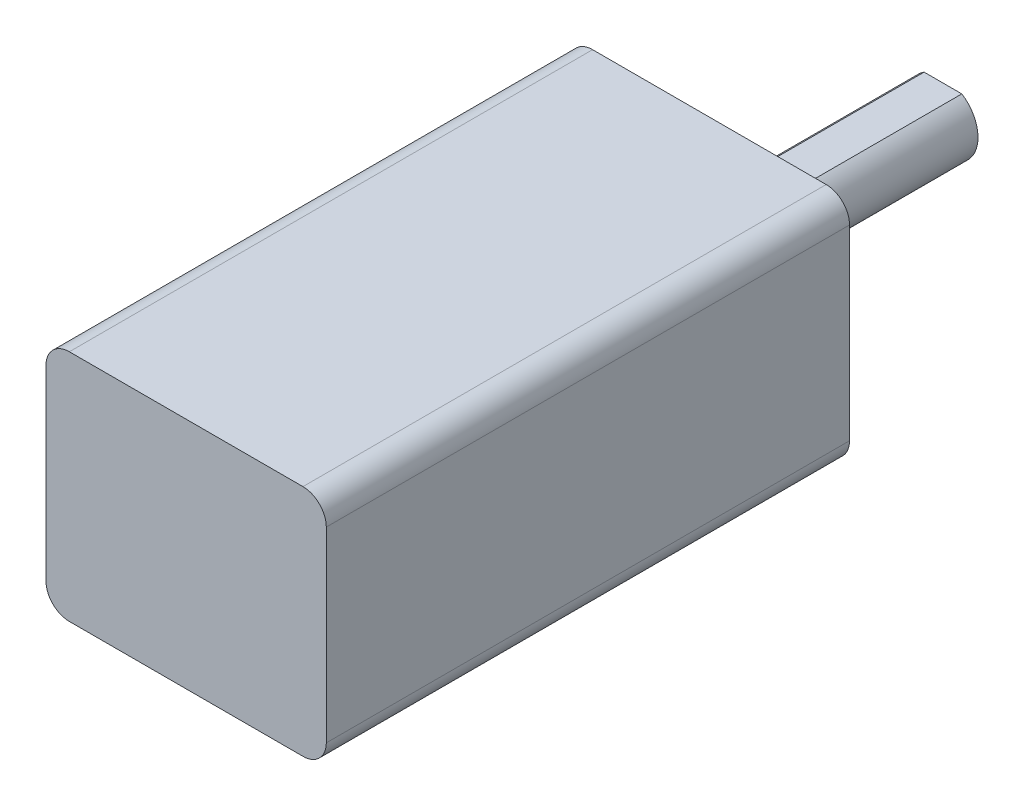
ISO-10303-21;
HEADER;
FILE_DESCRIPTION(('STEP AP214'),'2;1');
FILE_NAME('part.step','',(''),(''),'','','');
FILE_SCHEMA(('AUTOMOTIVE_DESIGN { 1 0 10303 214 1 1 1 1 }'));
ENDSEC;
DATA;
#1=APPLICATION_CONTEXT('core data for automotive mechanical design processes');
#2=APPLICATION_PROTOCOL_DEFINITION('international standard','automotive_design',2000,#1);
#3=PRODUCT_CONTEXT('',#1,'mechanical');
#4=PRODUCT('Part','Part','',(#3));
#5=PRODUCT_RELATED_PRODUCT_CATEGORY('part','',(#4));
#6=PRODUCT_DEFINITION_FORMATION('','',#4);
#7=PRODUCT_DEFINITION_CONTEXT('part definition',#1,'design');
#8=PRODUCT_DEFINITION('design','',#6,#7);
#9=PRODUCT_DEFINITION_SHAPE('','',#8);
#10=(LENGTH_UNIT() NAMED_UNIT(*) SI_UNIT(.MILLI.,.METRE.));
#11=(NAMED_UNIT(*) PLANE_ANGLE_UNIT() SI_UNIT($,.RADIAN.));
#12=(NAMED_UNIT(*) SI_UNIT($,.STERADIAN.) SOLID_ANGLE_UNIT());
#13=UNCERTAINTY_MEASURE_WITH_UNIT(LENGTH_MEASURE(1.E-05),#10,'distance_accuracy_value','');
#14=(GEOMETRIC_REPRESENTATION_CONTEXT(3) GLOBAL_UNCERTAINTY_ASSIGNED_CONTEXT((#13)) GLOBAL_UNIT_ASSIGNED_CONTEXT((#10,
#11,#12)) REPRESENTATION_CONTEXT('',''));
#15=CARTESIAN_POINT('',(0.,0.,0.));
#16=DIRECTION('',(0.,0.,1.));
#17=DIRECTION('',(1.,0.,0.));
#18=AXIS2_PLACEMENT_3D('',#15,#16,#17);
#19=CARTESIAN_POINT('',(-6.,-5.,22.4));
#20=DIRECTION('',(0.,1.,0.));
#21=DIRECTION('',(0.,0.,1.));
#22=AXIS2_PLACEMENT_3D('',#19,#20,#21);
#23=PLANE('',#22);
#24=DIRECTION('',(1.,0.,0.));
#25=VECTOR('',#24,1.);
#26=CARTESIAN_POINT('',(-6.,-5.,22.4));
#27=LINE('',#26,#25);
#28=CARTESIAN_POINT('',(-5.,-5.,22.4));
#29=VERTEX_POINT('',#28);
#30=CARTESIAN_POINT('',(5.,-5.,22.4));
#31=VERTEX_POINT('',#30);
#32=EDGE_CURVE('E134',#29,#31,#27,.T.);
#33=ORIENTED_EDGE('',*,*,#32,.F.);
#34=DIRECTION('',(0.,0.,-1.));
#35=VECTOR('',#34,1.);
#36=CARTESIAN_POINT('',(-5.,-5.,0.));
#37=LINE('',#36,#35);
#38=CARTESIAN_POINT('',(-5.,-5.,0.));
#39=VERTEX_POINT('',#38);
#40=EDGE_CURVE('E165',#29,#39,#37,.T.);
#41=ORIENTED_EDGE('',*,*,#40,.T.);
#42=DIRECTION('',(1.,0.,0.));
#43=VECTOR('',#42,1.);
#44=CARTESIAN_POINT('',(-6.,-5.,0.));
#45=LINE('',#44,#43);
#46=CARTESIAN_POINT('',(5.,-5.,0.));
#47=VERTEX_POINT('',#46);
#48=EDGE_CURVE('E130',#39,#47,#45,.T.);
#49=ORIENTED_EDGE('',*,*,#48,.T.);
#50=DIRECTION('',(0.,0.,-1.));
#51=VECTOR('',#50,1.);
#52=CARTESIAN_POINT('',(5.,-5.,22.4));
#53=LINE('',#52,#51);
#54=EDGE_CURVE('E163',#47,#31,#53,.F.);
#55=ORIENTED_EDGE('',*,*,#54,.T.);
#56=EDGE_LOOP('',(#33,#41,#49,#55));
#57=FACE_BOUND('',#56,.T.);
#58=ADVANCED_FACE('F36',(#57),#23,.F.);
#59=CARTESIAN_POINT('',(6.,-5.,22.4));
#60=DIRECTION('',(-1.,0.,0.));
#61=DIRECTION('',(0.,0.,1.));
#62=AXIS2_PLACEMENT_3D('',#59,#60,#61);
#63=PLANE('',#62);
#64=DIRECTION('',(0.,1.,0.));
#65=VECTOR('',#64,1.);
#66=CARTESIAN_POINT('',(6.,-5.,22.4));
#67=LINE('',#66,#65);
#68=CARTESIAN_POINT('',(6.,-4.,22.4));
#69=VERTEX_POINT('',#68);
#70=CARTESIAN_POINT('',(6.,4.,22.4));
#71=VERTEX_POINT('',#70);
#72=EDGE_CURVE('E137',#69,#71,#67,.T.);
#73=ORIENTED_EDGE('',*,*,#72,.F.);
#74=DIRECTION('',(0.,0.,-1.));
#75=VECTOR('',#74,1.);
#76=CARTESIAN_POINT('',(6.,-4.,22.4));
#77=LINE('',#76,#75);
#78=CARTESIAN_POINT('',(6.,-4.,0.));
#79=VERTEX_POINT('',#78);
#80=EDGE_CURVE('E183',#69,#79,#77,.T.);
#81=ORIENTED_EDGE('',*,*,#80,.T.);
#82=DIRECTION('',(0.,1.,0.));
#83=VECTOR('',#82,1.);
#84=CARTESIAN_POINT('',(6.,-5.,0.));
#85=LINE('',#84,#83);
#86=CARTESIAN_POINT('',(6.,4.,0.));
#87=VERTEX_POINT('',#86);
#88=EDGE_CURVE('E148',#79,#87,#85,.T.);
#89=ORIENTED_EDGE('',*,*,#88,.T.);
#90=DIRECTION('',(0.,0.,-1.));
#91=VECTOR('',#90,1.);
#92=CARTESIAN_POINT('',(6.,4.,22.4));
#93=LINE('',#92,#91);
#94=EDGE_CURVE('E58',#87,#71,#93,.F.);
#95=ORIENTED_EDGE('',*,*,#94,.T.);
#96=EDGE_LOOP('',(#73,#81,#89,#95));
#97=FACE_BOUND('',#96,.T.);
#98=ADVANCED_FACE('F219',(#97),#63,.F.);
#99=CARTESIAN_POINT('',(-6.,5.,22.4));
#100=DIRECTION('',(0.,1.,0.));
#101=DIRECTION('',(0.,0.,1.));
#102=AXIS2_PLACEMENT_3D('',#99,#100,#101);
#103=PLANE('',#102);
#104=DIRECTION('',(1.,0.,0.));
#105=VECTOR('',#104,1.);
#106=CARTESIAN_POINT('',(-6.,5.,22.4));
#107=LINE('',#106,#105);
#108=CARTESIAN_POINT('',(-5.,5.,22.4));
#109=VERTEX_POINT('',#108);
#110=CARTESIAN_POINT('',(5.,5.,22.4));
#111=VERTEX_POINT('',#110);
#112=EDGE_CURVE('E140',#109,#111,#107,.T.);
#113=ORIENTED_EDGE('',*,*,#112,.T.);
#114=DIRECTION('',(0.,0.,-1.));
#115=VECTOR('',#114,1.);
#116=CARTESIAN_POINT('',(5.,5.,0.));
#117=LINE('',#116,#115);
#118=CARTESIAN_POINT('',(5.,5.,0.));
#119=VERTEX_POINT('',#118);
#120=EDGE_CURVE('E44',#111,#119,#117,.T.);
#121=ORIENTED_EDGE('',*,*,#120,.T.);
#122=DIRECTION('',(1.,0.,0.));
#123=VECTOR('',#122,1.);
#124=CARTESIAN_POINT('',(-6.,5.,0.));
#125=LINE('',#124,#123);
#126=CARTESIAN_POINT('',(-5.,5.,0.));
#127=VERTEX_POINT('',#126);
#128=EDGE_CURVE('E150',#127,#119,#125,.T.);
#129=ORIENTED_EDGE('',*,*,#128,.F.);
#130=DIRECTION('',(0.,0.,-1.));
#131=VECTOR('',#130,1.);
#132=CARTESIAN_POINT('',(-5.,5.,22.4));
#133=LINE('',#132,#131);
#134=EDGE_CURVE('E158',#127,#109,#133,.F.);
#135=ORIENTED_EDGE('',*,*,#134,.T.);
#136=EDGE_LOOP('',(#113,#121,#129,#135));
#137=FACE_BOUND('',#136,.T.);
#138=ADVANCED_FACE('F189',(#137),#103,.T.);
#139=CARTESIAN_POINT('',(-6.,-5.,22.4));
#140=DIRECTION('',(-1.,0.,0.));
#141=DIRECTION('',(0.,0.,1.));
#142=AXIS2_PLACEMENT_3D('',#139,#140,#141);
#143=PLANE('',#142);
#144=DIRECTION('',(0.,1.,0.));
#145=VECTOR('',#144,1.);
#146=CARTESIAN_POINT('',(-6.,-5.,0.));
#147=LINE('',#146,#145);
#148=CARTESIAN_POINT('',(-6.,-4.,0.));
#149=VERTEX_POINT('',#148);
#150=CARTESIAN_POINT('',(-6.,4.,0.));
#151=VERTEX_POINT('',#150);
#152=EDGE_CURVE('E138',#149,#151,#147,.T.);
#153=ORIENTED_EDGE('',*,*,#152,.F.);
#154=DIRECTION('',(0.,0.,-1.));
#155=VECTOR('',#154,1.);
#156=CARTESIAN_POINT('',(-6.,-4.,22.4));
#157=LINE('',#156,#155);
#158=CARTESIAN_POINT('',(-6.,-4.,22.4));
#159=VERTEX_POINT('',#158);
#160=EDGE_CURVE('E174',#149,#159,#157,.F.);
#161=ORIENTED_EDGE('',*,*,#160,.T.);
#162=DIRECTION('',(0.,1.,0.));
#163=VECTOR('',#162,1.);
#164=CARTESIAN_POINT('',(-6.,-5.,22.4));
#165=LINE('',#164,#163);
#166=CARTESIAN_POINT('',(-6.,4.,22.4));
#167=VERTEX_POINT('',#166);
#168=EDGE_CURVE('E143',#159,#167,#165,.T.);
#169=ORIENTED_EDGE('',*,*,#168,.T.);
#170=DIRECTION('',(0.,0.,-1.));
#171=VECTOR('',#170,1.);
#172=CARTESIAN_POINT('',(-6.,4.,22.4));
#173=LINE('',#172,#171);
#174=EDGE_CURVE('E145',#167,#151,#173,.T.);
#175=ORIENTED_EDGE('',*,*,#174,.T.);
#176=EDGE_LOOP('',(#153,#161,#169,#175));
#177=FACE_BOUND('',#176,.T.);
#178=ADVANCED_FACE('F203',(#177),#143,.T.);
#179=CARTESIAN_POINT('',(0.,0.,22.4));
#180=DIRECTION('',(0.,0.,1.));
#181=DIRECTION('',(1.,0.,0.));
#182=AXIS2_PLACEMENT_3D('',#179,#180,#181);
#183=PLANE('',#182);
#184=ORIENTED_EDGE('',*,*,#168,.F.);
#185=CARTESIAN_POINT('',(-5.,-4.,22.4));
#186=DIRECTION('',(0.,0.,1.));
#187=DIRECTION('',(1.,0.,0.));
#188=AXIS2_PLACEMENT_3D('',#185,#186,#187);
#189=CIRCLE('',#188,1.);
#190=EDGE_CURVE('E180',#159,#29,#189,.T.);
#191=ORIENTED_EDGE('',*,*,#190,.T.);
#192=ORIENTED_EDGE('',*,*,#32,.T.);
#193=CARTESIAN_POINT('',(5.,-4.,22.4));
#194=DIRECTION('',(0.,0.,1.));
#195=DIRECTION('',(1.,0.,0.));
#196=AXIS2_PLACEMENT_3D('',#193,#194,#195);
#197=CIRCLE('',#196,1.);
#198=EDGE_CURVE('E178',#31,#69,#197,.T.);
#199=ORIENTED_EDGE('',*,*,#198,.T.);
#200=ORIENTED_EDGE('',*,*,#72,.T.);
#201=CARTESIAN_POINT('',(5.,4.,22.4));
#202=DIRECTION('',(0.,0.,1.));
#203=DIRECTION('',(1.,0.,0.));
#204=AXIS2_PLACEMENT_3D('',#201,#202,#203);
#205=CIRCLE('',#204,1.);
#206=EDGE_CURVE('E176',#71,#111,#205,.T.);
#207=ORIENTED_EDGE('',*,*,#206,.T.);
#208=ORIENTED_EDGE('',*,*,#112,.F.);
#209=CARTESIAN_POINT('',(-5.,4.,22.4));
#210=DIRECTION('',(0.,0.,1.));
#211=DIRECTION('',(1.,0.,0.));
#212=AXIS2_PLACEMENT_3D('',#209,#210,#211);
#213=CIRCLE('',#212,1.);
#214=EDGE_CURVE('E160',#109,#167,#213,.T.);
#215=ORIENTED_EDGE('',*,*,#214,.T.);
#216=EDGE_LOOP('',(#184,#191,#192,#199,#200,#207,#208,#215));
#217=FACE_BOUND('',#216,.T.);
#218=ADVANCED_FACE('F208',(#217),#183,.T.);
#219=CARTESIAN_POINT('',(0.,0.,0.));
#220=DIRECTION('',(0.,0.,1.));
#221=DIRECTION('',(1.,0.,0.));
#222=AXIS2_PLACEMENT_3D('',#219,#220,#221);
#223=PLANE('',#222);
#224=DIRECTION('',(1.,0.,0.));
#225=VECTOR('',#224,1.);
#226=CARTESIAN_POINT('',(-1.57252344087428,1.26430884646296,0.));
#227=LINE('',#226,#225);
#228=CARTESIAN_POINT('',(-0.80716983389835,1.26430884646296,0.));
#229=VERTEX_POINT('',#228);
#230=CARTESIAN_POINT('',(0.80716983389835,1.26430884646296,0.));
#231=VERTEX_POINT('',#230);
#232=EDGE_CURVE('E115',#229,#231,#227,.T.);
#233=ORIENTED_EDGE('',*,*,#232,.F.);
#234=CARTESIAN_POINT('',(0.,0.,0.));
#235=DIRECTION('',(0.,0.,1.));
#236=DIRECTION('',(1.,0.,0.));
#237=AXIS2_PLACEMENT_3D('',#234,#235,#236);
#238=CIRCLE('',#237,1.5);
#239=EDGE_CURVE('E125',#229,#231,#238,.T.);
#240=ORIENTED_EDGE('',*,*,#239,.T.);
#241=EDGE_LOOP('',(#233,#240));
#242=FACE_BOUND('',#241,.T.);
#243=ORIENTED_EDGE('',*,*,#48,.F.);
#244=CARTESIAN_POINT('',(-5.,-4.,0.));
#245=DIRECTION('',(0.,0.,1.));
#246=DIRECTION('',(1.,0.,0.));
#247=AXIS2_PLACEMENT_3D('',#244,#245,#246);
#248=CIRCLE('',#247,1.);
#249=EDGE_CURVE('E172',#39,#149,#248,.F.);
#250=ORIENTED_EDGE('',*,*,#249,.T.);
#251=ORIENTED_EDGE('',*,*,#152,.T.);
#252=CARTESIAN_POINT('',(-5.,4.,0.));
#253=DIRECTION('',(0.,0.,1.));
#254=DIRECTION('',(1.,0.,0.));
#255=AXIS2_PLACEMENT_3D('',#252,#253,#254);
#256=CIRCLE('',#255,1.);
#257=EDGE_CURVE('E156',#151,#127,#256,.F.);
#258=ORIENTED_EDGE('',*,*,#257,.T.);
#259=ORIENTED_EDGE('',*,*,#128,.T.);
#260=CARTESIAN_POINT('',(5.,4.,0.));
#261=DIRECTION('',(0.,0.,1.));
#262=DIRECTION('',(1.,0.,0.));
#263=AXIS2_PLACEMENT_3D('',#260,#261,#262);
#264=CIRCLE('',#263,1.);
#265=EDGE_CURVE('E168',#119,#87,#264,.F.);
#266=ORIENTED_EDGE('',*,*,#265,.T.);
#267=ORIENTED_EDGE('',*,*,#88,.F.);
#268=CARTESIAN_POINT('',(5.,-4.,0.));
#269=DIRECTION('',(0.,0.,1.));
#270=DIRECTION('',(1.,0.,0.));
#271=AXIS2_PLACEMENT_3D('',#268,#269,#270);
#272=CIRCLE('',#271,1.);
#273=EDGE_CURVE('E170',#79,#47,#272,.F.);
#274=ORIENTED_EDGE('',*,*,#273,.T.);
#275=EDGE_LOOP('',(#243,#250,#251,#258,#259,#266,#267,#274));
#276=FACE_BOUND('',#275,.T.);
#277=ADVANCED_FACE('F123',(#242,#276),#223,.F.);
#278=CARTESIAN_POINT('',(0.,0.,-10.));
#279=DIRECTION('',(0.,0.,1.));
#280=DIRECTION('',(1.,0.,0.));
#281=AXIS2_PLACEMENT_3D('',#278,#279,#280);
#282=CYLINDRICAL_SURFACE('',#281,1.5);
#283=DIRECTION('',(0.,0.,1.));
#284=VECTOR('',#283,1.);
#285=CARTESIAN_POINT('',(0.80716983389835,1.26430884646296,-10.));
#286=LINE('',#285,#284);
#287=CARTESIAN_POINT('',(0.80716983389835,1.26430884646296,-10.));
#288=VERTEX_POINT('',#287);
#289=EDGE_CURVE('E51',#231,#288,#286,.F.);
#290=ORIENTED_EDGE('',*,*,#289,.F.);
#291=ORIENTED_EDGE('',*,*,#239,.F.);
#292=DIRECTION('',(0.,0.,1.));
#293=VECTOR('',#292,1.);
#294=CARTESIAN_POINT('',(-0.80716983389835,1.26430884646296,-10.));
#295=LINE('',#294,#293);
#296=CARTESIAN_POINT('',(-0.80716983389835,1.26430884646296,-10.));
#297=VERTEX_POINT('',#296);
#298=EDGE_CURVE('E112',#297,#229,#295,.T.);
#299=ORIENTED_EDGE('',*,*,#298,.F.);
#300=CARTESIAN_POINT('',(0.,0.,-10.));
#301=DIRECTION('',(0.,0.,1.));
#302=DIRECTION('',(1.,0.,0.));
#303=AXIS2_PLACEMENT_3D('',#300,#301,#302);
#304=CIRCLE('',#303,1.5);
#305=EDGE_CURVE('E128',#297,#288,#304,.T.);
#306=ORIENTED_EDGE('',*,*,#305,.T.);
#307=EDGE_LOOP('',(#290,#291,#299,#306));
#308=FACE_BOUND('',#307,.T.);
#309=ADVANCED_FACE('F127',(#308),#282,.T.);
#310=CARTESIAN_POINT('',(0.,0.,-10.));
#311=DIRECTION('',(0.,0.,1.));
#312=DIRECTION('',(1.,0.,0.));
#313=AXIS2_PLACEMENT_3D('',#310,#311,#312);
#314=PLANE('',#313);
#315=ORIENTED_EDGE('',*,*,#305,.F.);
#316=DIRECTION('',(1.,0.,0.));
#317=VECTOR('',#316,1.);
#318=CARTESIAN_POINT('',(0.,1.26430884646296,-10.));
#319=LINE('',#318,#317);
#320=EDGE_CURVE('E11',#297,#288,#319,.T.);
#321=ORIENTED_EDGE('',*,*,#320,.T.);
#322=EDGE_LOOP('',(#315,#321));
#323=FACE_BOUND('',#322,.T.);
#324=ADVANCED_FACE('F231',(#323),#314,.F.);
#325=CARTESIAN_POINT('',(-5.,4.,22.4));
#326=DIRECTION('',(0.,0.,-1.));
#327=DIRECTION('',(-1.,0.,0.));
#328=AXIS2_PLACEMENT_3D('',#325,#326,#327);
#329=CYLINDRICAL_SURFACE('',#328,1.);
#330=ORIENTED_EDGE('',*,*,#214,.F.);
#331=ORIENTED_EDGE('',*,*,#134,.F.);
#332=ORIENTED_EDGE('',*,*,#257,.F.);
#333=ORIENTED_EDGE('',*,*,#174,.F.);
#334=EDGE_LOOP('',(#330,#331,#332,#333));
#335=FACE_BOUND('',#334,.T.);
#336=ADVANCED_FACE('F201',(#335),#329,.T.);
#337=CARTESIAN_POINT('',(-5.,-4.,22.4));
#338=DIRECTION('',(0.,0.,1.));
#339=DIRECTION('',(1.,0.,0.));
#340=AXIS2_PLACEMENT_3D('',#337,#338,#339);
#341=CYLINDRICAL_SURFACE('',#340,1.);
#342=ORIENTED_EDGE('',*,*,#190,.F.);
#343=ORIENTED_EDGE('',*,*,#160,.F.);
#344=ORIENTED_EDGE('',*,*,#249,.F.);
#345=ORIENTED_EDGE('',*,*,#40,.F.);
#346=EDGE_LOOP('',(#342,#343,#344,#345));
#347=FACE_BOUND('',#346,.T.);
#348=ADVANCED_FACE('F216',(#347),#341,.T.);
#349=CARTESIAN_POINT('',(5.,-4.,22.4));
#350=DIRECTION('',(0.,0.,-1.));
#351=DIRECTION('',(-1.,0.,0.));
#352=AXIS2_PLACEMENT_3D('',#349,#350,#351);
#353=CYLINDRICAL_SURFACE('',#352,1.);
#354=ORIENTED_EDGE('',*,*,#198,.F.);
#355=ORIENTED_EDGE('',*,*,#54,.F.);
#356=ORIENTED_EDGE('',*,*,#273,.F.);
#357=ORIENTED_EDGE('',*,*,#80,.F.);
#358=EDGE_LOOP('',(#354,#355,#356,#357));
#359=FACE_BOUND('',#358,.T.);
#360=ADVANCED_FACE('F210',(#359),#353,.T.);
#361=CARTESIAN_POINT('',(5.,4.,22.4));
#362=DIRECTION('',(0.,0.,1.));
#363=DIRECTION('',(1.,0.,0.));
#364=AXIS2_PLACEMENT_3D('',#361,#362,#363);
#365=CYLINDRICAL_SURFACE('',#364,1.);
#366=ORIENTED_EDGE('',*,*,#206,.F.);
#367=ORIENTED_EDGE('',*,*,#94,.F.);
#368=ORIENTED_EDGE('',*,*,#265,.F.);
#369=ORIENTED_EDGE('',*,*,#120,.F.);
#370=EDGE_LOOP('',(#366,#367,#368,#369));
#371=FACE_BOUND('',#370,.T.);
#372=ADVANCED_FACE('F38',(#371),#365,.T.);
#373=CARTESIAN_POINT('',(-1.57252344087428,1.26430884646296,-10.));
#374=DIRECTION('',(0.,-1.,0.));
#375=DIRECTION('',(0.,0.,-1.));
#376=AXIS2_PLACEMENT_3D('',#373,#374,#375);
#377=PLANE('',#376);
#378=ORIENTED_EDGE('',*,*,#289,.T.);
#379=ORIENTED_EDGE('',*,*,#320,.F.);
#380=ORIENTED_EDGE('',*,*,#298,.T.);
#381=ORIENTED_EDGE('',*,*,#232,.T.);
#382=EDGE_LOOP('',(#378,#379,#380,#381));
#383=FACE_BOUND('',#382,.T.);
#384=ADVANCED_FACE('F114',(#383),#377,.F.);
#385=CLOSED_SHELL('',(#58,#98,#138,#178,#218,#277,#309,#324,#336,#348,#360,#372,#384));
#386=MANIFOLD_SOLID_BREP('B2',#385);
#387=ADVANCED_BREP_SHAPE_REPRESENTATION('',(#18,#386),#14);
#388=SHAPE_DEFINITION_REPRESENTATION(#9,#387);
ENDSEC;
END-ISO-10303-21;
